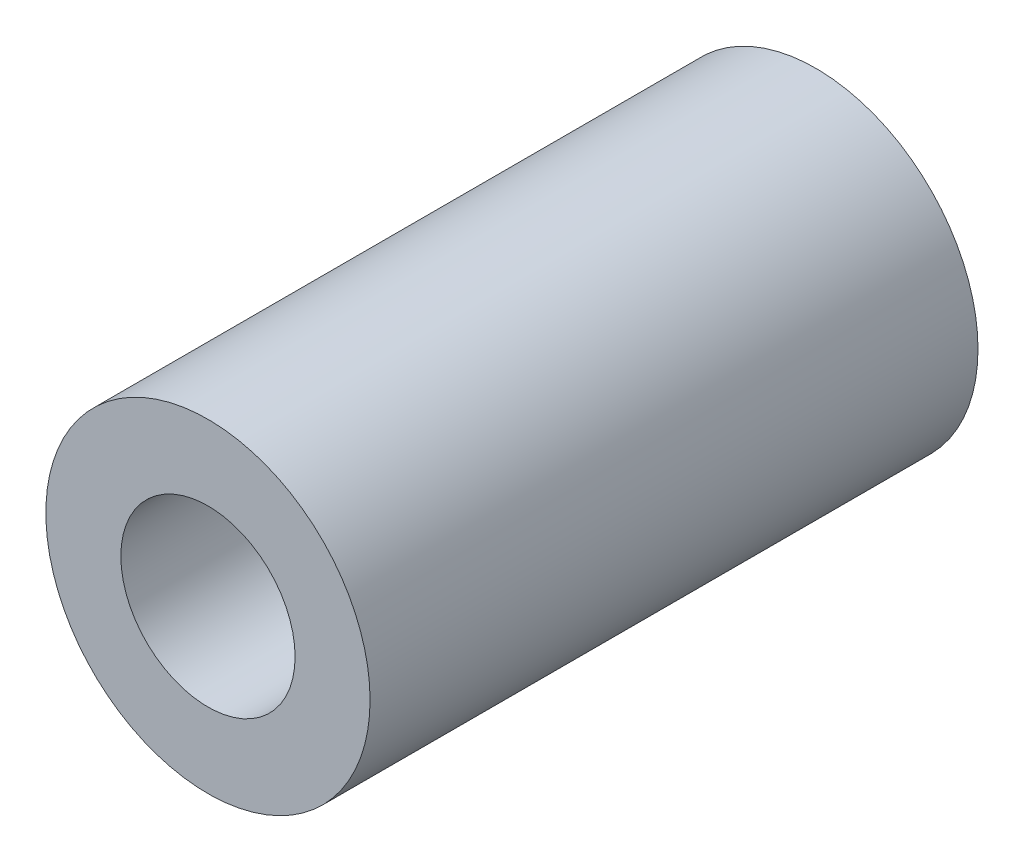
ISO-10303-21;
HEADER;
FILE_DESCRIPTION(('STEP AP214'),'2;1');
FILE_NAME('part.step','',(''),(''),'','','');
FILE_SCHEMA(('AUTOMOTIVE_DESIGN { 1 0 10303 214 1 1 1 1 }'));
ENDSEC;
DATA;
#1=APPLICATION_CONTEXT('core data for automotive mechanical design processes');
#2=APPLICATION_PROTOCOL_DEFINITION('international standard','automotive_design',2000,#1);
#3=PRODUCT_CONTEXT('',#1,'mechanical');
#4=PRODUCT('Part','Part','',(#3));
#5=PRODUCT_RELATED_PRODUCT_CATEGORY('part','',(#4));
#6=PRODUCT_DEFINITION_FORMATION('','',#4);
#7=PRODUCT_DEFINITION_CONTEXT('part definition',#1,'design');
#8=PRODUCT_DEFINITION('design','',#6,#7);
#9=PRODUCT_DEFINITION_SHAPE('','',#8);
#10=(LENGTH_UNIT() NAMED_UNIT(*) SI_UNIT(.MILLI.,.METRE.));
#11=(NAMED_UNIT(*) PLANE_ANGLE_UNIT() SI_UNIT($,.RADIAN.));
#12=(NAMED_UNIT(*) SI_UNIT($,.STERADIAN.) SOLID_ANGLE_UNIT());
#13=UNCERTAINTY_MEASURE_WITH_UNIT(LENGTH_MEASURE(1.E-05),#10,'distance_accuracy_value','');
#14=(GEOMETRIC_REPRESENTATION_CONTEXT(3) GLOBAL_UNCERTAINTY_ASSIGNED_CONTEXT((#13)) GLOBAL_UNIT_ASSIGNED_CONTEXT((#10,
#11,#12)) REPRESENTATION_CONTEXT('',''));
#15=CARTESIAN_POINT('',(0.,0.,0.));
#16=DIRECTION('',(0.,0.,1.));
#17=DIRECTION('',(1.,0.,0.));
#18=AXIS2_PLACEMENT_3D('',#15,#16,#17);
#19=CARTESIAN_POINT('',(0.,0.,7.5));
#20=DIRECTION('',(0.,0.,1.));
#21=DIRECTION('',(1.,0.,0.));
#22=AXIS2_PLACEMENT_3D('',#19,#20,#21);
#23=PLANE('',#22);
#24=CARTESIAN_POINT('',(0.,0.,7.5));
#25=DIRECTION('',(0.,0.,1.));
#26=DIRECTION('',(1.,0.,0.));
#27=AXIS2_PLACEMENT_3D('',#24,#25,#26);
#28=CIRCLE('',#27,4.);
#29=CARTESIAN_POINT('',(4.,0.,7.5));
#30=VERTEX_POINT('',#29);
#31=EDGE_CURVE('E10',#30,#30,#28,.T.);
#32=ORIENTED_EDGE('',*,*,#31,.T.);
#33=EDGE_LOOP('',(#32));
#34=FACE_BOUND('',#33,.T.);
#35=CARTESIAN_POINT('',(0.,0.,7.5));
#36=DIRECTION('',(0.,0.,1.));
#37=DIRECTION('',(1.,0.,0.));
#38=AXIS2_PLACEMENT_3D('',#35,#36,#37);
#39=CIRCLE('',#38,2.15);
#40=CARTESIAN_POINT('',(2.15,0.,7.5));
#41=VERTEX_POINT('',#40);
#42=EDGE_CURVE('E44',#41,#41,#39,.T.);
#43=ORIENTED_EDGE('',*,*,#42,.F.);
#44=EDGE_LOOP('',(#43));
#45=FACE_BOUND('',#44,.T.);
#46=ADVANCED_FACE('F33',(#34,#45),#23,.T.);
#47=CARTESIAN_POINT('',(0.,0.,-7.5));
#48=DIRECTION('',(0.,0.,1.));
#49=DIRECTION('',(1.,0.,0.));
#50=AXIS2_PLACEMENT_3D('',#47,#48,#49);
#51=PLANE('',#50);
#52=CARTESIAN_POINT('',(0.,0.,-7.5));
#53=DIRECTION('',(0.,0.,1.));
#54=DIRECTION('',(1.,0.,0.));
#55=AXIS2_PLACEMENT_3D('',#52,#53,#54);
#56=CIRCLE('',#55,4.);
#57=CARTESIAN_POINT('',(4.,0.,-7.5));
#58=VERTEX_POINT('',#57);
#59=EDGE_CURVE('E37',#58,#58,#56,.T.);
#60=ORIENTED_EDGE('',*,*,#59,.F.);
#61=EDGE_LOOP('',(#60));
#62=FACE_BOUND('',#61,.T.);
#63=CARTESIAN_POINT('',(0.,0.,-7.5));
#64=DIRECTION('',(0.,0.,1.));
#65=DIRECTION('',(1.,0.,0.));
#66=AXIS2_PLACEMENT_3D('',#63,#64,#65);
#67=CIRCLE('',#66,2.15);
#68=CARTESIAN_POINT('',(2.15,0.,-7.5));
#69=VERTEX_POINT('',#68);
#70=EDGE_CURVE('E46',#69,#69,#67,.T.);
#71=ORIENTED_EDGE('',*,*,#70,.T.);
#72=EDGE_LOOP('',(#71));
#73=FACE_BOUND('',#72,.T.);
#74=ADVANCED_FACE('F56',(#62,#73),#51,.F.);
#75=CARTESIAN_POINT('',(0.,0.,7.5));
#76=DIRECTION('',(0.,0.,-1.));
#77=DIRECTION('',(-1.,0.,0.));
#78=AXIS2_PLACEMENT_3D('',#75,#76,#77);
#79=CYLINDRICAL_SURFACE('',#78,4.);
#80=ORIENTED_EDGE('',*,*,#31,.F.);
#81=EDGE_LOOP('',(#80));
#82=FACE_BOUND('',#81,.T.);
#83=ORIENTED_EDGE('',*,*,#59,.T.);
#84=EDGE_LOOP('',(#83));
#85=FACE_BOUND('',#84,.T.);
#86=ADVANCED_FACE('F35',(#82,#85),#79,.T.);
#87=CARTESIAN_POINT('',(0.,0.,7.5));
#88=DIRECTION('',(0.,0.,-1.));
#89=DIRECTION('',(-1.,0.,0.));
#90=AXIS2_PLACEMENT_3D('',#87,#88,#89);
#91=CYLINDRICAL_SURFACE('',#90,2.15);
#92=ORIENTED_EDGE('',*,*,#42,.T.);
#93=EDGE_LOOP('',(#92));
#94=FACE_BOUND('',#93,.T.);
#95=ORIENTED_EDGE('',*,*,#70,.F.);
#96=EDGE_LOOP('',(#95));
#97=FACE_BOUND('',#96,.T.);
#98=ADVANCED_FACE('F52',(#94,#97),#91,.F.);
#99=CLOSED_SHELL('',(#46,#74,#86,#98));
#100=MANIFOLD_SOLID_BREP('B2',#99);
#101=ADVANCED_BREP_SHAPE_REPRESENTATION('',(#18,#100),#14);
#102=SHAPE_DEFINITION_REPRESENTATION(#9,#101);
ENDSEC;
END-ISO-10303-21;
